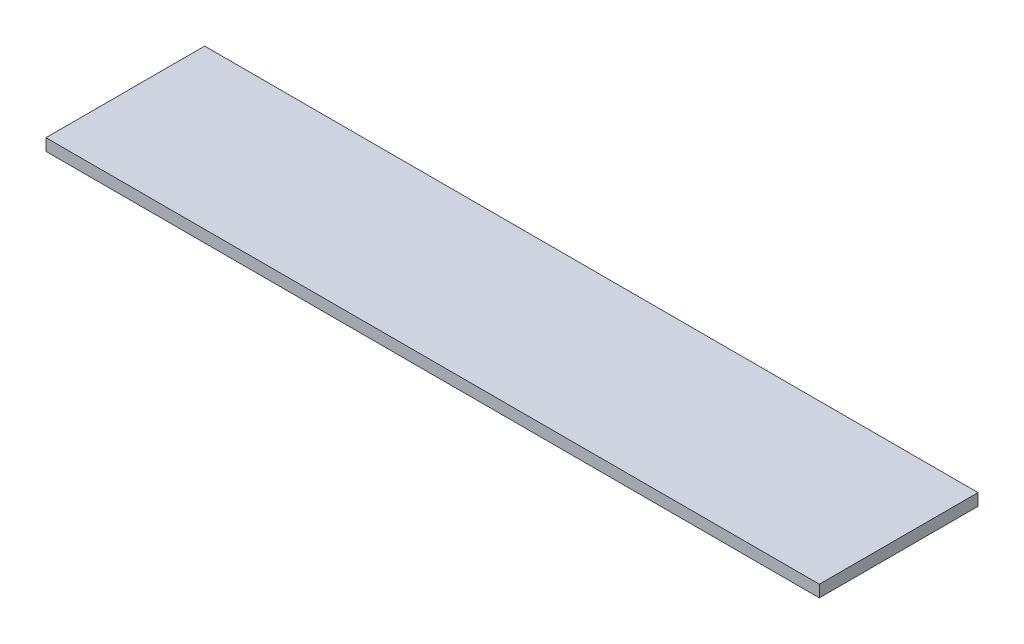
ISO-10303-21;
HEADER;
FILE_DESCRIPTION(('STEP AP214'),'2;1');
FILE_NAME('part.step','',(''),(''),'','','');
FILE_SCHEMA(('AUTOMOTIVE_DESIGN { 1 0 10303 214 1 1 1 1 }'));
ENDSEC;
DATA;
#1=APPLICATION_CONTEXT('core data for automotive mechanical design processes');
#2=APPLICATION_PROTOCOL_DEFINITION('international standard','automotive_design',2000,#1);
#3=PRODUCT_CONTEXT('',#1,'mechanical');
#4=PRODUCT('Part','Part','',(#3));
#5=PRODUCT_RELATED_PRODUCT_CATEGORY('part','',(#4));
#6=PRODUCT_DEFINITION_FORMATION('','',#4);
#7=PRODUCT_DEFINITION_CONTEXT('part definition',#1,'design');
#8=PRODUCT_DEFINITION('design','',#6,#7);
#9=PRODUCT_DEFINITION_SHAPE('','',#8);
#10=(LENGTH_UNIT() NAMED_UNIT(*) SI_UNIT(.MILLI.,.METRE.));
#11=(NAMED_UNIT(*) PLANE_ANGLE_UNIT() SI_UNIT($,.RADIAN.));
#12=(NAMED_UNIT(*) SI_UNIT($,.STERADIAN.) SOLID_ANGLE_UNIT());
#13=UNCERTAINTY_MEASURE_WITH_UNIT(LENGTH_MEASURE(1.E-05),#10,'distance_accuracy_value','');
#14=(GEOMETRIC_REPRESENTATION_CONTEXT(3) GLOBAL_UNCERTAINTY_ASSIGNED_CONTEXT((#13)) GLOBAL_UNIT_ASSIGNED_CONTEXT((#10,
#11,#12)) REPRESENTATION_CONTEXT('',''));
#15=CARTESIAN_POINT('',(0.,0.,0.));
#16=DIRECTION('',(0.,0.,1.));
#17=DIRECTION('',(1.,0.,0.));
#18=AXIS2_PLACEMENT_3D('',#15,#16,#17);
#19=CARTESIAN_POINT('',(585.,18.,-120.));
#20=DIRECTION('',(-1.,0.,0.));
#21=DIRECTION('',(0.,0.,1.));
#22=AXIS2_PLACEMENT_3D('',#19,#20,#21);
#23=PLANE('',#22);
#24=DIRECTION('',(0.,0.,-1.));
#25=VECTOR('',#24,1.);
#26=CARTESIAN_POINT('',(585.,0.,-120.));
#27=LINE('',#26,#25);
#28=CARTESIAN_POINT('',(585.,0.,120.));
#29=VERTEX_POINT('',#28);
#30=CARTESIAN_POINT('',(585.,0.,-120.));
#31=VERTEX_POINT('',#30);
#32=EDGE_CURVE('E96',#29,#31,#27,.T.);
#33=ORIENTED_EDGE('',*,*,#32,.T.);
#34=DIRECTION('',(0.,-1.,0.));
#35=VECTOR('',#34,1.);
#36=CARTESIAN_POINT('',(585.,18.,-120.));
#37=LINE('',#36,#35);
#38=CARTESIAN_POINT('',(585.,18.,-120.));
#39=VERTEX_POINT('',#38);
#40=EDGE_CURVE('E11',#39,#31,#37,.T.);
#41=ORIENTED_EDGE('',*,*,#40,.F.);
#42=DIRECTION('',(0.,0.,-1.));
#43=VECTOR('',#42,1.);
#44=CARTESIAN_POINT('',(585.,18.,-120.));
#45=LINE('',#44,#43);
#46=CARTESIAN_POINT('',(585.,18.,120.));
#47=VERTEX_POINT('',#46);
#48=EDGE_CURVE('E84',#47,#39,#45,.T.);
#49=ORIENTED_EDGE('',*,*,#48,.F.);
#50=DIRECTION('',(0.,-1.,0.));
#51=VECTOR('',#50,1.);
#52=CARTESIAN_POINT('',(585.,18.,120.));
#53=LINE('',#52,#51);
#54=EDGE_CURVE('E92',#47,#29,#53,.T.);
#55=ORIENTED_EDGE('',*,*,#54,.T.);
#56=EDGE_LOOP('',(#33,#41,#49,#55));
#57=FACE_BOUND('',#56,.T.);
#58=ADVANCED_FACE('F33',(#57),#23,.F.);
#59=CARTESIAN_POINT('',(-585.,18.,-120.));
#60=DIRECTION('',(0.,0.,1.));
#61=DIRECTION('',(1.,0.,0.));
#62=AXIS2_PLACEMENT_3D('',#59,#60,#61);
#63=PLANE('',#62);
#64=DIRECTION('',(-1.,0.,0.));
#65=VECTOR('',#64,1.);
#66=CARTESIAN_POINT('',(-585.,0.,-120.));
#67=LINE('',#66,#65);
#68=CARTESIAN_POINT('',(-585.,0.,-120.));
#69=VERTEX_POINT('',#68);
#70=EDGE_CURVE('E88',#31,#69,#67,.T.);
#71=ORIENTED_EDGE('',*,*,#70,.T.);
#72=DIRECTION('',(0.,-1.,0.));
#73=VECTOR('',#72,1.);
#74=CARTESIAN_POINT('',(-585.,18.,-120.));
#75=LINE('',#74,#73);
#76=CARTESIAN_POINT('',(-585.,18.,-120.));
#77=VERTEX_POINT('',#76);
#78=EDGE_CURVE('E41',#77,#69,#75,.T.);
#79=ORIENTED_EDGE('',*,*,#78,.F.);
#80=DIRECTION('',(-1.,0.,0.));
#81=VECTOR('',#80,1.);
#82=CARTESIAN_POINT('',(-585.,18.,-120.));
#83=LINE('',#82,#81);
#84=EDGE_CURVE('E79',#39,#77,#83,.T.);
#85=ORIENTED_EDGE('',*,*,#84,.F.);
#86=ORIENTED_EDGE('',*,*,#40,.T.);
#87=EDGE_LOOP('',(#71,#79,#85,#86));
#88=FACE_BOUND('',#87,.T.);
#89=ADVANCED_FACE('F87',(#88),#63,.F.);
#90=CARTESIAN_POINT('',(-585.,18.,-120.));
#91=DIRECTION('',(1.,0.,0.));
#92=DIRECTION('',(0.,0.,-1.));
#93=AXIS2_PLACEMENT_3D('',#90,#91,#92);
#94=PLANE('',#93);
#95=DIRECTION('',(0.,0.,1.));
#96=VECTOR('',#95,1.);
#97=CARTESIAN_POINT('',(-585.,0.,-120.));
#98=LINE('',#97,#96);
#99=CARTESIAN_POINT('',(-585.,0.,120.));
#100=VERTEX_POINT('',#99);
#101=EDGE_CURVE('E66',#69,#100,#98,.T.);
#102=ORIENTED_EDGE('',*,*,#101,.T.);
#103=DIRECTION('',(0.,-1.,0.));
#104=VECTOR('',#103,1.);
#105=CARTESIAN_POINT('',(-585.,18.,120.));
#106=LINE('',#105,#104);
#107=CARTESIAN_POINT('',(-585.,18.,120.));
#108=VERTEX_POINT('',#107);
#109=EDGE_CURVE('E89',#108,#100,#106,.T.);
#110=ORIENTED_EDGE('',*,*,#109,.F.);
#111=DIRECTION('',(0.,0.,1.));
#112=VECTOR('',#111,1.);
#113=CARTESIAN_POINT('',(-585.,18.,-120.));
#114=LINE('',#113,#112);
#115=EDGE_CURVE('E82',#77,#108,#114,.T.);
#116=ORIENTED_EDGE('',*,*,#115,.F.);
#117=ORIENTED_EDGE('',*,*,#78,.T.);
#118=EDGE_LOOP('',(#102,#110,#116,#117));
#119=FACE_BOUND('',#118,.T.);
#120=ADVANCED_FACE('F90',(#119),#94,.F.);
#121=CARTESIAN_POINT('',(-585.,18.,120.));
#122=DIRECTION('',(0.,0.,-1.));
#123=DIRECTION('',(-1.,0.,0.));
#124=AXIS2_PLACEMENT_3D('',#121,#122,#123);
#125=PLANE('',#124);
#126=DIRECTION('',(1.,0.,0.));
#127=VECTOR('',#126,1.);
#128=CARTESIAN_POINT('',(-585.,0.,120.));
#129=LINE('',#128,#127);
#130=EDGE_CURVE('E72',#100,#29,#129,.T.);
#131=ORIENTED_EDGE('',*,*,#130,.T.);
#132=ORIENTED_EDGE('',*,*,#54,.F.);
#133=DIRECTION('',(1.,0.,0.));
#134=VECTOR('',#133,1.);
#135=CARTESIAN_POINT('',(-585.,18.,120.));
#136=LINE('',#135,#134);
#137=EDGE_CURVE('E49',#108,#47,#136,.T.);
#138=ORIENTED_EDGE('',*,*,#137,.F.);
#139=ORIENTED_EDGE('',*,*,#109,.T.);
#140=EDGE_LOOP('',(#131,#132,#138,#139));
#141=FACE_BOUND('',#140,.T.);
#142=ADVANCED_FACE('F103',(#141),#125,.F.);
#143=CARTESIAN_POINT('',(0.,18.,0.));
#144=DIRECTION('',(0.,1.,0.));
#145=DIRECTION('',(0.,0.,1.));
#146=AXIS2_PLACEMENT_3D('',#143,#144,#145);
#147=PLANE('',#146);
#148=ORIENTED_EDGE('',*,*,#48,.T.);
#149=ORIENTED_EDGE('',*,*,#84,.T.);
#150=ORIENTED_EDGE('',*,*,#115,.T.);
#151=ORIENTED_EDGE('',*,*,#137,.T.);
#152=EDGE_LOOP('',(#148,#149,#150,#151));
#153=FACE_BOUND('',#152,.T.);
#154=ADVANCED_FACE('F80',(#153),#147,.T.);
#155=CARTESIAN_POINT('',(0.,0.,0.));
#156=DIRECTION('',(0.,1.,0.));
#157=DIRECTION('',(0.,0.,1.));
#158=AXIS2_PLACEMENT_3D('',#155,#156,#157);
#159=PLANE('',#158);
#160=ORIENTED_EDGE('',*,*,#32,.F.);
#161=ORIENTED_EDGE('',*,*,#130,.F.);
#162=ORIENTED_EDGE('',*,*,#101,.F.);
#163=ORIENTED_EDGE('',*,*,#70,.F.);
#164=EDGE_LOOP('',(#160,#161,#162,#163));
#165=FACE_BOUND('',#164,.T.);
#166=ADVANCED_FACE('F106',(#165),#159,.F.);
#167=CLOSED_SHELL('',(#58,#89,#120,#142,#154,#166));
#168=MANIFOLD_SOLID_BREP('B2',#167);
#169=ADVANCED_BREP_SHAPE_REPRESENTATION('',(#18,#168),#14);
#170=SHAPE_DEFINITION_REPRESENTATION(#9,#169);
ENDSEC;
END-ISO-10303-21;
